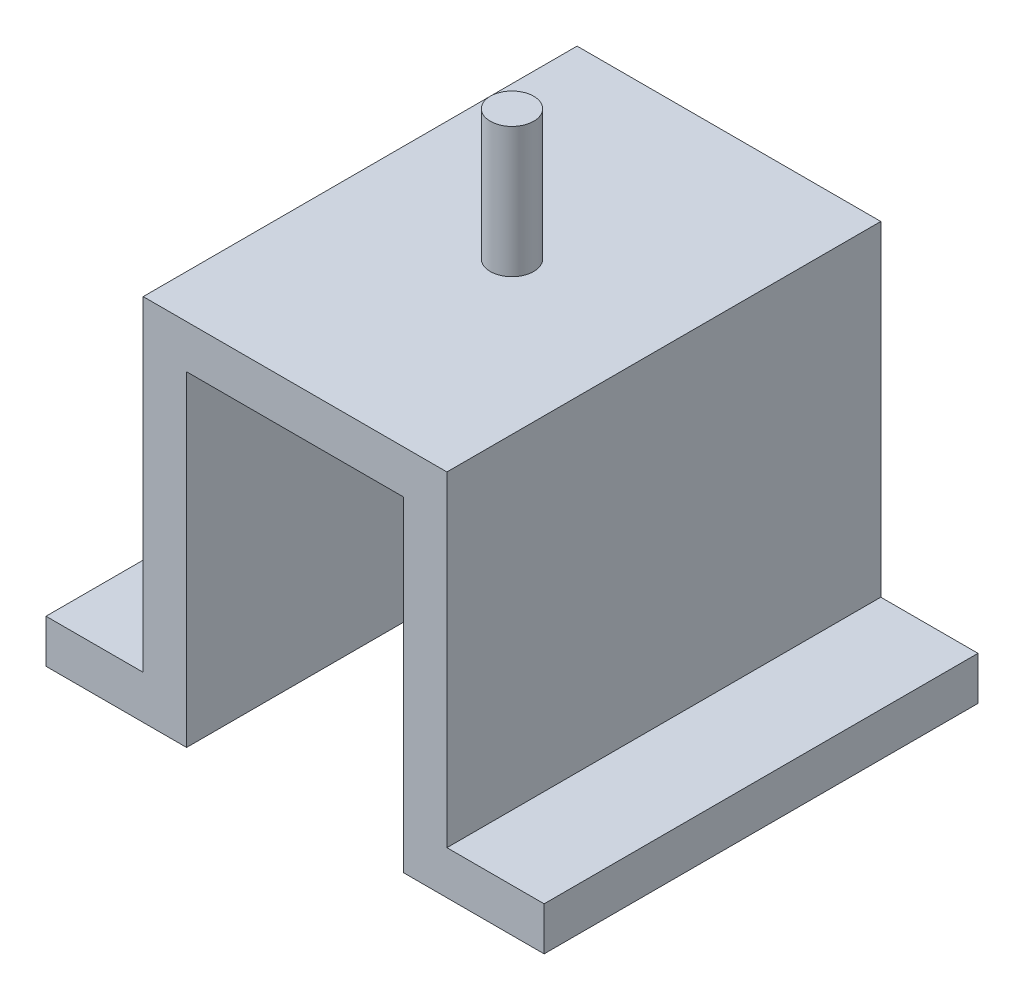
ISO-10303-21;
HEADER;
FILE_DESCRIPTION(('STEP AP214'),'2;1');
FILE_NAME('part.step','',(''),(''),'','','');
FILE_SCHEMA(('AUTOMOTIVE_DESIGN { 1 0 10303 214 1 1 1 1 }'));
ENDSEC;
DATA;
#1=APPLICATION_CONTEXT('core data for automotive mechanical design processes');
#2=APPLICATION_PROTOCOL_DEFINITION('international standard','automotive_design',2000,#1);
#3=PRODUCT_CONTEXT('',#1,'mechanical');
#4=PRODUCT('Part','Part','',(#3));
#5=PRODUCT_RELATED_PRODUCT_CATEGORY('part','',(#4));
#6=PRODUCT_DEFINITION_FORMATION('','',#4);
#7=PRODUCT_DEFINITION_CONTEXT('part definition',#1,'design');
#8=PRODUCT_DEFINITION('design','',#6,#7);
#9=PRODUCT_DEFINITION_SHAPE('','',#8);
#10=(LENGTH_UNIT() NAMED_UNIT(*) SI_UNIT(.MILLI.,.METRE.));
#11=(NAMED_UNIT(*) PLANE_ANGLE_UNIT() SI_UNIT($,.RADIAN.));
#12=(NAMED_UNIT(*) SI_UNIT($,.STERADIAN.) SOLID_ANGLE_UNIT());
#13=UNCERTAINTY_MEASURE_WITH_UNIT(LENGTH_MEASURE(1.E-05),#10,'distance_accuracy_value','');
#14=(GEOMETRIC_REPRESENTATION_CONTEXT(3) GLOBAL_UNCERTAINTY_ASSIGNED_CONTEXT((#13)) GLOBAL_UNIT_ASSIGNED_CONTEXT((#10,
#11,#12)) REPRESENTATION_CONTEXT('',''));
#15=CARTESIAN_POINT('',(0.,0.,0.));
#16=DIRECTION('',(0.,0.,1.));
#17=DIRECTION('',(1.,0.,0.));
#18=AXIS2_PLACEMENT_3D('',#15,#16,#17);
#19=CARTESIAN_POINT('',(0.,39.5144538231221,0.));
#20=DIRECTION('',(0.,1.,0.));
#21=DIRECTION('',(-1.,0.,0.));
#22=AXIS2_PLACEMENT_3D('',#19,#20,#21);
#23=PLANE('',#22);
#24=DIRECTION('',(0.,0.,1.));
#25=VECTOR('',#24,1.);
#26=CARTESIAN_POINT('',(-35.,39.5144538231221,0.));
#27=LINE('',#26,#25);
#28=CARTESIAN_POINT('',(-35.,39.5144538231221,0.));
#29=VERTEX_POINT('',#28);
#30=CARTESIAN_POINT('',(-35.,39.5144538231221,100.));
#31=VERTEX_POINT('',#30);
#32=EDGE_CURVE('E167',#29,#31,#27,.T.);
#33=ORIENTED_EDGE('',*,*,#32,.T.);
#34=DIRECTION('',(1.,0.,0.));
#35=VECTOR('',#34,1.);
#36=CARTESIAN_POINT('',(-35.,39.5144538231221,100.));
#37=LINE('',#36,#35);
#38=CARTESIAN_POINT('',(35.,39.5144538231221,100.));
#39=VERTEX_POINT('',#38);
#40=EDGE_CURVE('E170',#31,#39,#37,.T.);
#41=ORIENTED_EDGE('',*,*,#40,.T.);
#42=DIRECTION('',(0.,0.,-1.));
#43=VECTOR('',#42,1.);
#44=CARTESIAN_POINT('',(35.,39.5144538231221,0.));
#45=LINE('',#44,#43);
#46=CARTESIAN_POINT('',(35.,39.5144538231221,0.));
#47=VERTEX_POINT('',#46);
#48=EDGE_CURVE('E173',#39,#47,#45,.T.);
#49=ORIENTED_EDGE('',*,*,#48,.T.);
#50=DIRECTION('',(-1.,0.,0.));
#51=VECTOR('',#50,1.);
#52=CARTESIAN_POINT('',(-35.,39.5144538231221,0.));
#53=LINE('',#52,#51);
#54=EDGE_CURVE('E176',#47,#29,#53,.T.);
#55=ORIENTED_EDGE('',*,*,#54,.T.);
#56=EDGE_LOOP('',(#33,#41,#49,#55));
#57=FACE_BOUND('',#56,.T.);
#58=CARTESIAN_POINT('',(0.,39.5144538231221,50.));
#59=DIRECTION('',(0.,1.,0.));
#60=DIRECTION('',(-1.,0.,0.));
#61=AXIS2_PLACEMENT_3D('',#58,#59,#60);
#62=CIRCLE('',#61,5.);
#63=CARTESIAN_POINT('',(-5.00000000000003,39.5144538231221,50.));
#64=VERTEX_POINT('',#63);
#65=EDGE_CURVE('E391',#64,#64,#62,.T.);
#66=ORIENTED_EDGE('',*,*,#65,.F.);
#67=EDGE_LOOP('',(#66));
#68=FACE_BOUND('',#67,.T.);
#69=ADVANCED_FACE('F35',(#57,#68),#23,.T.);
#70=CARTESIAN_POINT('',(0.,29.5144538231221,0.));
#71=DIRECTION('',(0.,1.,0.));
#72=DIRECTION('',(-1.,0.,0.));
#73=AXIS2_PLACEMENT_3D('',#70,#71,#72);
#74=PLANE('',#73);
#75=DIRECTION('',(0.,0.,-1.));
#76=VECTOR('',#75,1.);
#77=CARTESIAN_POINT('',(-25.,29.5144538231221,100.));
#78=LINE('',#77,#76);
#79=CARTESIAN_POINT('',(-25.,29.5144538231221,100.));
#80=VERTEX_POINT('',#79);
#81=CARTESIAN_POINT('',(-25.,29.5144538231221,0.));
#82=VERTEX_POINT('',#81);
#83=EDGE_CURVE('E163',#80,#82,#78,.T.);
#84=ORIENTED_EDGE('',*,*,#83,.T.);
#85=DIRECTION('',(-1.,0.,0.));
#86=VECTOR('',#85,1.);
#87=CARTESIAN_POINT('',(-35.,29.5144538231221,0.));
#88=LINE('',#87,#86);
#89=CARTESIAN_POINT('',(25.,29.5144538231221,0.));
#90=VERTEX_POINT('',#89);
#91=EDGE_CURVE('E83',#90,#82,#88,.T.);
#92=ORIENTED_EDGE('',*,*,#91,.F.);
#93=DIRECTION('',(0.,0.,-1.));
#94=VECTOR('',#93,1.);
#95=CARTESIAN_POINT('',(25.,29.5144538231221,100.));
#96=LINE('',#95,#94);
#97=CARTESIAN_POINT('',(25.,29.5144538231221,100.));
#98=VERTEX_POINT('',#97);
#99=EDGE_CURVE('E193',#98,#90,#96,.T.);
#100=ORIENTED_EDGE('',*,*,#99,.F.);
#101=DIRECTION('',(1.,0.,0.));
#102=VECTOR('',#101,1.);
#103=CARTESIAN_POINT('',(-35.,29.5144538231221,100.));
#104=LINE('',#103,#102);
#105=EDGE_CURVE('E39',#80,#98,#104,.T.);
#106=ORIENTED_EDGE('',*,*,#105,.F.);
#107=EDGE_LOOP('',(#84,#92,#100,#106));
#108=FACE_BOUND('',#107,.T.);
#109=ADVANCED_FACE('F261',(#108),#74,.F.);
#110=CARTESIAN_POINT('',(25.,29.5144538231221,100.));
#111=DIRECTION('',(1.,0.,0.));
#112=DIRECTION('',(0.,1.,0.));
#113=AXIS2_PLACEMENT_3D('',#110,#111,#112);
#114=PLANE('',#113);
#115=DIRECTION('',(0.,-1.,0.));
#116=VECTOR('',#115,1.);
#117=CARTESIAN_POINT('',(25.,29.5144538231221,0.));
#118=LINE('',#117,#116);
#119=CARTESIAN_POINT('',(25.,-45.4855461768779,0.));
#120=VERTEX_POINT('',#119);
#121=EDGE_CURVE('E197',#90,#120,#118,.T.);
#122=ORIENTED_EDGE('',*,*,#121,.T.);
#123=DIRECTION('',(0.,0.,-1.));
#124=VECTOR('',#123,1.);
#125=CARTESIAN_POINT('',(25.,-45.4855461768779,100.));
#126=LINE('',#125,#124);
#127=CARTESIAN_POINT('',(25.,-45.4855461768779,100.));
#128=VERTEX_POINT('',#127);
#129=EDGE_CURVE('E11',#128,#120,#126,.T.);
#130=ORIENTED_EDGE('',*,*,#129,.F.);
#131=DIRECTION('',(0.,-1.,0.));
#132=VECTOR('',#131,1.);
#133=CARTESIAN_POINT('',(25.,29.5144538231221,100.));
#134=LINE('',#133,#132);
#135=EDGE_CURVE('E188',#98,#128,#134,.T.);
#136=ORIENTED_EDGE('',*,*,#135,.F.);
#137=ORIENTED_EDGE('',*,*,#99,.T.);
#138=EDGE_LOOP('',(#122,#130,#136,#137));
#139=FACE_BOUND('',#138,.T.);
#140=ADVANCED_FACE('F37',(#139),#114,.F.);
#141=CARTESIAN_POINT('',(57.4040103991189,-45.4855461768779,100.));
#142=DIRECTION('',(0.,1.,0.));
#143=DIRECTION('',(0.,0.,1.));
#144=AXIS2_PLACEMENT_3D('',#141,#142,#143);
#145=PLANE('',#144);
#146=DIRECTION('',(1.,0.,0.));
#147=VECTOR('',#146,1.);
#148=CARTESIAN_POINT('',(57.4040103991189,-45.4855461768779,0.));
#149=LINE('',#148,#147);
#150=CARTESIAN_POINT('',(57.4040103991189,-45.4855461768779,0.));
#151=VERTEX_POINT('',#150);
#152=EDGE_CURVE('E194',#120,#151,#149,.T.);
#153=ORIENTED_EDGE('',*,*,#152,.T.);
#154=DIRECTION('',(0.,0.,-1.));
#155=VECTOR('',#154,1.);
#156=CARTESIAN_POINT('',(57.4040103991189,-45.4855461768779,100.));
#157=LINE('',#156,#155);
#158=CARTESIAN_POINT('',(57.4040103991189,-45.4855461768779,100.));
#159=VERTEX_POINT('',#158);
#160=EDGE_CURVE('E46',#159,#151,#157,.T.);
#161=ORIENTED_EDGE('',*,*,#160,.F.);
#162=DIRECTION('',(1.,0.,0.));
#163=VECTOR('',#162,1.);
#164=CARTESIAN_POINT('',(57.4040103991189,-45.4855461768779,100.));
#165=LINE('',#164,#163);
#166=EDGE_CURVE('E90',#128,#159,#165,.T.);
#167=ORIENTED_EDGE('',*,*,#166,.F.);
#168=ORIENTED_EDGE('',*,*,#129,.T.);
#169=EDGE_LOOP('',(#153,#161,#167,#168));
#170=FACE_BOUND('',#169,.T.);
#171=ADVANCED_FACE('F219',(#170),#145,.F.);
#172=CARTESIAN_POINT('',(57.4040103991189,-35.4855461768779,100.));
#173=DIRECTION('',(-1.,0.,0.));
#174=DIRECTION('',(0.,-1.,0.));
#175=AXIS2_PLACEMENT_3D('',#172,#173,#174);
#176=PLANE('',#175);
#177=DIRECTION('',(0.,1.,0.));
#178=VECTOR('',#177,1.);
#179=CARTESIAN_POINT('',(57.4040103991189,-35.4855461768779,0.));
#180=LINE('',#179,#178);
#181=CARTESIAN_POINT('',(57.4040103991189,-35.4855461768779,0.));
#182=VERTEX_POINT('',#181);
#183=EDGE_CURVE('E196',#151,#182,#180,.T.);
#184=ORIENTED_EDGE('',*,*,#183,.T.);
#185=DIRECTION('',(0.,0.,-1.));
#186=VECTOR('',#185,1.);
#187=CARTESIAN_POINT('',(57.4040103991189,-35.4855461768779,100.));
#188=LINE('',#187,#186);
#189=CARTESIAN_POINT('',(57.4040103991189,-35.4855461768779,100.));
#190=VERTEX_POINT('',#189);
#191=EDGE_CURVE('E227',#190,#182,#188,.T.);
#192=ORIENTED_EDGE('',*,*,#191,.F.);
#193=DIRECTION('',(0.,1.,0.));
#194=VECTOR('',#193,1.);
#195=CARTESIAN_POINT('',(57.4040103991189,-35.4855461768779,100.));
#196=LINE('',#195,#194);
#197=EDGE_CURVE('E187',#159,#190,#196,.T.);
#198=ORIENTED_EDGE('',*,*,#197,.F.);
#199=ORIENTED_EDGE('',*,*,#160,.T.);
#200=EDGE_LOOP('',(#184,#192,#198,#199));
#201=FACE_BOUND('',#200,.T.);
#202=ADVANCED_FACE('F225',(#201),#176,.F.);
#203=CARTESIAN_POINT('',(35.,-35.4855461768779,100.));
#204=DIRECTION('',(0.,-1.,0.));
#205=DIRECTION('',(0.,0.,-1.));
#206=AXIS2_PLACEMENT_3D('',#203,#204,#205);
#207=PLANE('',#206);
#208=DIRECTION('',(-1.,0.,0.));
#209=VECTOR('',#208,1.);
#210=CARTESIAN_POINT('',(35.,-35.4855461768779,0.));
#211=LINE('',#210,#209);
#212=CARTESIAN_POINT('',(35.,-35.4855461768779,0.));
#213=VERTEX_POINT('',#212);
#214=EDGE_CURVE('E75',#182,#213,#211,.T.);
#215=ORIENTED_EDGE('',*,*,#214,.T.);
#216=DIRECTION('',(0.,0.,-1.));
#217=VECTOR('',#216,1.);
#218=CARTESIAN_POINT('',(35.,-35.4855461768779,100.));
#219=LINE('',#218,#217);
#220=CARTESIAN_POINT('',(35.,-35.4855461768779,100.));
#221=VERTEX_POINT('',#220);
#222=EDGE_CURVE('E204',#221,#213,#219,.T.);
#223=ORIENTED_EDGE('',*,*,#222,.F.);
#224=DIRECTION('',(-1.,0.,0.));
#225=VECTOR('',#224,1.);
#226=CARTESIAN_POINT('',(35.,-35.4855461768779,100.));
#227=LINE('',#226,#225);
#228=EDGE_CURVE('E55',#190,#221,#227,.T.);
#229=ORIENTED_EDGE('',*,*,#228,.F.);
#230=ORIENTED_EDGE('',*,*,#191,.T.);
#231=EDGE_LOOP('',(#215,#223,#229,#230));
#232=FACE_BOUND('',#231,.T.);
#233=ADVANCED_FACE('F290',(#232),#207,.F.);
#234=CARTESIAN_POINT('',(35.,29.5144538231221,100.));
#235=DIRECTION('',(-1.,0.,0.));
#236=DIRECTION('',(0.,-1.,0.));
#237=AXIS2_PLACEMENT_3D('',#234,#235,#236);
#238=PLANE('',#237);
#239=DIRECTION('',(0.,1.,0.));
#240=VECTOR('',#239,1.);
#241=CARTESIAN_POINT('',(35.,29.5144538231221,0.));
#242=LINE('',#241,#240);
#243=EDGE_CURVE('E200',#213,#47,#242,.T.);
#244=ORIENTED_EDGE('',*,*,#243,.T.);
#245=ORIENTED_EDGE('',*,*,#48,.F.);
#246=DIRECTION('',(0.,1.,0.));
#247=VECTOR('',#246,1.);
#248=CARTESIAN_POINT('',(35.,29.5144538231221,100.));
#249=LINE('',#248,#247);
#250=EDGE_CURVE('E191',#221,#39,#249,.T.);
#251=ORIENTED_EDGE('',*,*,#250,.F.);
#252=ORIENTED_EDGE('',*,*,#222,.T.);
#253=EDGE_LOOP('',(#244,#245,#251,#252));
#254=FACE_BOUND('',#253,.T.);
#255=ADVANCED_FACE('F234',(#254),#238,.F.);
#256=CARTESIAN_POINT('',(0.,0.,100.));
#257=DIRECTION('',(0.,0.,-1.));
#258=DIRECTION('',(-1.,0.,0.));
#259=AXIS2_PLACEMENT_3D('',#256,#257,#258);
#260=PLANE('',#259);
#261=ORIENTED_EDGE('',*,*,#135,.T.);
#262=ORIENTED_EDGE('',*,*,#166,.T.);
#263=ORIENTED_EDGE('',*,*,#197,.T.);
#264=ORIENTED_EDGE('',*,*,#228,.T.);
#265=ORIENTED_EDGE('',*,*,#250,.T.);
#266=ORIENTED_EDGE('',*,*,#40,.F.);
#267=DIRECTION('',(0.,-1.,0.));
#268=VECTOR('',#267,1.);
#269=CARTESIAN_POINT('',(-35.,39.5144538231221,100.));
#270=LINE('',#269,#268);
#271=CARTESIAN_POINT('',(-35.,-35.4855461768779,100.));
#272=VERTEX_POINT('',#271);
#273=EDGE_CURVE('E185',#31,#272,#270,.T.);
#274=ORIENTED_EDGE('',*,*,#273,.T.);
#275=DIRECTION('',(-1.,0.,0.));
#276=VECTOR('',#275,1.);
#277=CARTESIAN_POINT('',(-35.,-35.4855461768779,100.));
#278=LINE('',#277,#276);
#279=CARTESIAN_POINT('',(-57.4040103991189,-35.4855461768779,100.));
#280=VERTEX_POINT('',#279);
#281=EDGE_CURVE('E153',#272,#280,#278,.T.);
#282=ORIENTED_EDGE('',*,*,#281,.T.);
#283=DIRECTION('',(0.,-1.,0.));
#284=VECTOR('',#283,1.);
#285=CARTESIAN_POINT('',(-57.4040103991189,-35.4855461768779,100.));
#286=LINE('',#285,#284);
#287=CARTESIAN_POINT('',(-57.4040103991189,-45.4855461768779,100.));
#288=VERTEX_POINT('',#287);
#289=EDGE_CURVE('E148',#280,#288,#286,.T.);
#290=ORIENTED_EDGE('',*,*,#289,.T.);
#291=DIRECTION('',(1.,0.,0.));
#292=VECTOR('',#291,1.);
#293=CARTESIAN_POINT('',(-57.4040103991189,-45.4855461768779,100.));
#294=LINE('',#293,#292);
#295=CARTESIAN_POINT('',(-25.,-45.4855461768779,100.));
#296=VERTEX_POINT('',#295);
#297=EDGE_CURVE('E138',#288,#296,#294,.T.);
#298=ORIENTED_EDGE('',*,*,#297,.T.);
#299=DIRECTION('',(0.,1.,0.));
#300=VECTOR('',#299,1.);
#301=CARTESIAN_POINT('',(-25.,29.5144538231221,100.));
#302=LINE('',#301,#300);
#303=EDGE_CURVE('E147',#296,#80,#302,.T.);
#304=ORIENTED_EDGE('',*,*,#303,.T.);
#305=ORIENTED_EDGE('',*,*,#105,.T.);
#306=EDGE_LOOP('',(#261,#262,#263,#264,#265,#266,#274,#282,#290,#298,#304,#305));
#307=FACE_BOUND('',#306,.T.);
#308=ADVANCED_FACE('F151',(#307),#260,.F.);
#309=CARTESIAN_POINT('',(0.,0.,0.));
#310=DIRECTION('',(0.,0.,-1.));
#311=DIRECTION('',(-1.,0.,0.));
#312=AXIS2_PLACEMENT_3D('',#309,#310,#311);
#313=PLANE('',#312);
#314=ORIENTED_EDGE('',*,*,#121,.F.);
#315=ORIENTED_EDGE('',*,*,#91,.T.);
#316=DIRECTION('',(0.,1.,0.));
#317=VECTOR('',#316,1.);
#318=CARTESIAN_POINT('',(-25.,29.5144538231221,0.));
#319=LINE('',#318,#317);
#320=CARTESIAN_POINT('',(-25.,-45.4855461768779,0.));
#321=VERTEX_POINT('',#320);
#322=EDGE_CURVE('E258',#321,#82,#319,.T.);
#323=ORIENTED_EDGE('',*,*,#322,.F.);
#324=DIRECTION('',(1.,0.,0.));
#325=VECTOR('',#324,1.);
#326=CARTESIAN_POINT('',(-57.4040103991189,-45.4855461768779,0.));
#327=LINE('',#326,#325);
#328=CARTESIAN_POINT('',(-57.4040103991189,-45.4855461768779,0.));
#329=VERTEX_POINT('',#328);
#330=EDGE_CURVE('E255',#329,#321,#327,.T.);
#331=ORIENTED_EDGE('',*,*,#330,.F.);
#332=DIRECTION('',(0.,-1.,0.));
#333=VECTOR('',#332,1.);
#334=CARTESIAN_POINT('',(-57.4040103991189,-35.4855461768779,0.));
#335=LINE('',#334,#333);
#336=CARTESIAN_POINT('',(-57.4040103991189,-35.4855461768779,0.));
#337=VERTEX_POINT('',#336);
#338=EDGE_CURVE('E161',#337,#329,#335,.T.);
#339=ORIENTED_EDGE('',*,*,#338,.F.);
#340=DIRECTION('',(-1.,0.,0.));
#341=VECTOR('',#340,1.);
#342=CARTESIAN_POINT('',(-35.,-35.4855461768779,0.));
#343=LINE('',#342,#341);
#344=CARTESIAN_POINT('',(-35.,-35.4855461768779,0.));
#345=VERTEX_POINT('',#344);
#346=EDGE_CURVE('E157',#345,#337,#343,.T.);
#347=ORIENTED_EDGE('',*,*,#346,.F.);
#348=DIRECTION('',(0.,-1.,0.));
#349=VECTOR('',#348,1.);
#350=CARTESIAN_POINT('',(-35.,39.5144538231221,0.));
#351=LINE('',#350,#349);
#352=EDGE_CURVE('E177',#29,#345,#351,.T.);
#353=ORIENTED_EDGE('',*,*,#352,.F.);
#354=ORIENTED_EDGE('',*,*,#54,.F.);
#355=ORIENTED_EDGE('',*,*,#243,.F.);
#356=ORIENTED_EDGE('',*,*,#214,.F.);
#357=ORIENTED_EDGE('',*,*,#183,.F.);
#358=ORIENTED_EDGE('',*,*,#152,.F.);
#359=EDGE_LOOP('',(#314,#315,#323,#331,#339,#347,#353,#354,#355,#356,#357,#358));
#360=FACE_BOUND('',#359,.T.);
#361=ADVANCED_FACE('F228',(#360),#313,.T.);
#362=CARTESIAN_POINT('',(-35.,39.5144538231221,0.));
#363=DIRECTION('',(1.,0.,0.));
#364=DIRECTION('',(0.,1.,0.));
#365=AXIS2_PLACEMENT_3D('',#362,#363,#364);
#366=PLANE('',#365);
#367=ORIENTED_EDGE('',*,*,#352,.T.);
#368=DIRECTION('',(0.,0.,-1.));
#369=VECTOR('',#368,1.);
#370=CARTESIAN_POINT('',(-35.,-35.4855461768779,100.));
#371=LINE('',#370,#369);
#372=EDGE_CURVE('E243',#272,#345,#371,.T.);
#373=ORIENTED_EDGE('',*,*,#372,.F.);
#374=ORIENTED_EDGE('',*,*,#273,.F.);
#375=ORIENTED_EDGE('',*,*,#32,.F.);
#376=EDGE_LOOP('',(#367,#373,#374,#375));
#377=FACE_BOUND('',#376,.T.);
#378=ADVANCED_FACE('F244',(#377),#366,.F.);
#379=CARTESIAN_POINT('',(-57.4040103991189,-35.4855461768779,100.));
#380=DIRECTION('',(1.,0.,0.));
#381=DIRECTION('',(0.,1.,0.));
#382=AXIS2_PLACEMENT_3D('',#379,#380,#381);
#383=PLANE('',#382);
#384=ORIENTED_EDGE('',*,*,#338,.T.);
#385=DIRECTION('',(0.,0.,-1.));
#386=VECTOR('',#385,1.);
#387=CARTESIAN_POINT('',(-57.4040103991189,-45.4855461768779,100.));
#388=LINE('',#387,#386);
#389=EDGE_CURVE('E142',#288,#329,#388,.T.);
#390=ORIENTED_EDGE('',*,*,#389,.F.);
#391=ORIENTED_EDGE('',*,*,#289,.F.);
#392=DIRECTION('',(0.,0.,-1.));
#393=VECTOR('',#392,1.);
#394=CARTESIAN_POINT('',(-57.4040103991189,-35.4855461768779,100.));
#395=LINE('',#394,#393);
#396=EDGE_CURVE('E247',#280,#337,#395,.T.);
#397=ORIENTED_EDGE('',*,*,#396,.T.);
#398=EDGE_LOOP('',(#384,#390,#391,#397));
#399=FACE_BOUND('',#398,.T.);
#400=ADVANCED_FACE('F159',(#399),#383,.F.);
#401=CARTESIAN_POINT('',(-57.4040103991189,-45.4855461768779,100.));
#402=DIRECTION('',(0.,1.,0.));
#403=DIRECTION('',(0.,0.,1.));
#404=AXIS2_PLACEMENT_3D('',#401,#402,#403);
#405=PLANE('',#404);
#406=ORIENTED_EDGE('',*,*,#330,.T.);
#407=DIRECTION('',(0.,0.,-1.));
#408=VECTOR('',#407,1.);
#409=CARTESIAN_POINT('',(-25.,-45.4855461768779,100.));
#410=LINE('',#409,#408);
#411=EDGE_CURVE('E145',#296,#321,#410,.T.);
#412=ORIENTED_EDGE('',*,*,#411,.F.);
#413=ORIENTED_EDGE('',*,*,#297,.F.);
#414=ORIENTED_EDGE('',*,*,#389,.T.);
#415=EDGE_LOOP('',(#406,#412,#413,#414));
#416=FACE_BOUND('',#415,.T.);
#417=ADVANCED_FACE('F140',(#416),#405,.F.);
#418=CARTESIAN_POINT('',(-25.,29.5144538231221,100.));
#419=DIRECTION('',(-1.,0.,0.));
#420=DIRECTION('',(0.,-1.,0.));
#421=AXIS2_PLACEMENT_3D('',#418,#419,#420);
#422=PLANE('',#421);
#423=ORIENTED_EDGE('',*,*,#322,.T.);
#424=ORIENTED_EDGE('',*,*,#83,.F.);
#425=ORIENTED_EDGE('',*,*,#303,.F.);
#426=ORIENTED_EDGE('',*,*,#411,.T.);
#427=EDGE_LOOP('',(#423,#424,#425,#426));
#428=FACE_BOUND('',#427,.T.);
#429=ADVANCED_FACE('F264',(#428),#422,.F.);
#430=CARTESIAN_POINT('',(-35.,-35.4855461768779,100.));
#431=DIRECTION('',(0.,-1.,0.));
#432=DIRECTION('',(0.,0.,-1.));
#433=AXIS2_PLACEMENT_3D('',#430,#431,#432);
#434=PLANE('',#433);
#435=ORIENTED_EDGE('',*,*,#346,.T.);
#436=ORIENTED_EDGE('',*,*,#396,.F.);
#437=ORIENTED_EDGE('',*,*,#281,.F.);
#438=ORIENTED_EDGE('',*,*,#372,.T.);
#439=EDGE_LOOP('',(#435,#436,#437,#438));
#440=FACE_BOUND('',#439,.T.);
#441=ADVANCED_FACE('F249',(#440),#434,.F.);
#442=CARTESIAN_POINT('',(0.,69.5144538231221,50.));
#443=DIRECTION('',(0.,-1.,0.));
#444=DIRECTION('',(1.,0.,0.));
#445=AXIS2_PLACEMENT_3D('',#442,#443,#444);
#446=CYLINDRICAL_SURFACE('',#445,5.);
#447=CARTESIAN_POINT('',(0.,69.5144538231221,50.));
#448=DIRECTION('',(0.,1.,0.));
#449=DIRECTION('',(-1.,0.,0.));
#450=AXIS2_PLACEMENT_3D('',#447,#448,#449);
#451=CIRCLE('',#450,5.);
#452=CARTESIAN_POINT('',(-5.00000000000005,69.5144538231221,50.));
#453=VERTEX_POINT('',#452);
#454=EDGE_CURVE('E256',#453,#453,#451,.T.);
#455=ORIENTED_EDGE('',*,*,#454,.F.);
#456=EDGE_LOOP('',(#455));
#457=FACE_BOUND('',#456,.T.);
#458=ORIENTED_EDGE('',*,*,#65,.T.);
#459=EDGE_LOOP('',(#458));
#460=FACE_BOUND('',#459,.T.);
#461=ADVANCED_FACE('F271',(#457,#460),#446,.T.);
#462=CARTESIAN_POINT('',(0.,69.5144538231221,50.));
#463=DIRECTION('',(0.,1.,0.));
#464=DIRECTION('',(-1.,0.,0.));
#465=AXIS2_PLACEMENT_3D('',#462,#463,#464);
#466=PLANE('',#465);
#467=ORIENTED_EDGE('',*,*,#454,.T.);
#468=EDGE_LOOP('',(#467));
#469=FACE_BOUND('',#468,.T.);
#470=ADVANCED_FACE('F375',(#469),#466,.T.);
#471=CLOSED_SHELL('',(#69,#109,#140,#171,#202,#233,#255,#308,#361,#378,#400,#417,#429,#441,#461,#470));
#472=MANIFOLD_SOLID_BREP('B2',#471);
#473=ADVANCED_BREP_SHAPE_REPRESENTATION('',(#18,#472),#14);
#474=SHAPE_DEFINITION_REPRESENTATION(#9,#473);
ENDSEC;
END-ISO-10303-21;
